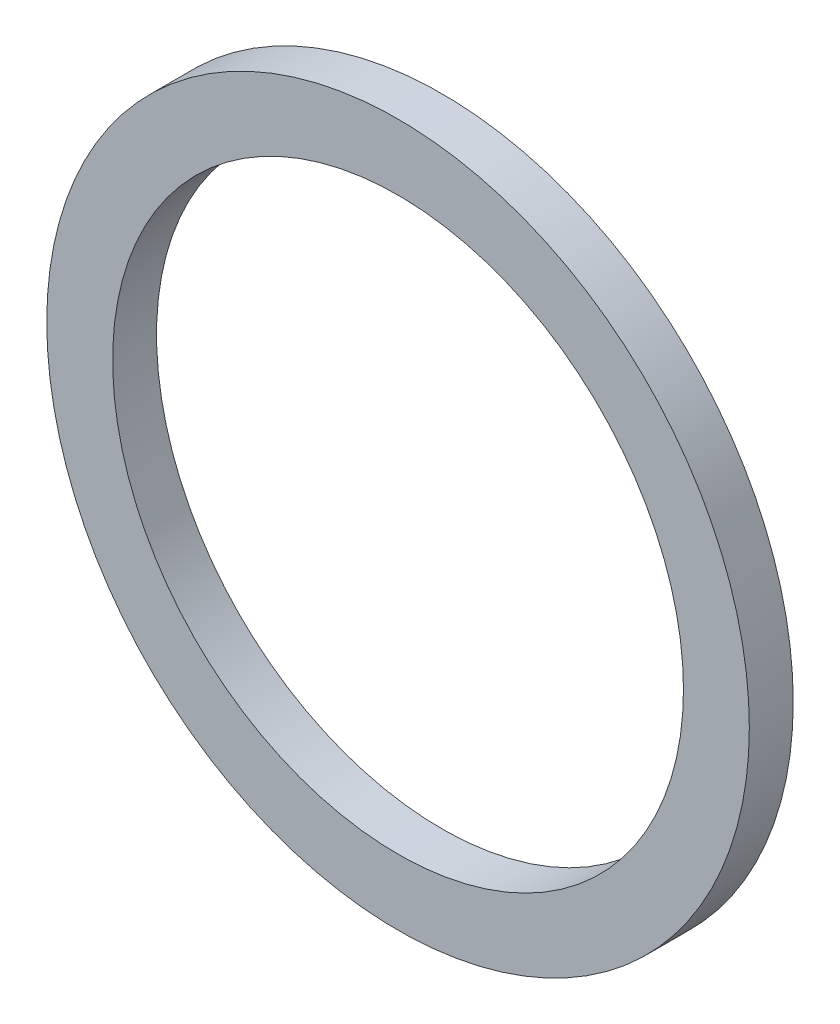
ISO-10303-21;
HEADER;
FILE_DESCRIPTION(('STEP AP214'),'2;1');
FILE_NAME('part.step','',(''),(''),'','','');
FILE_SCHEMA(('AUTOMOTIVE_DESIGN { 1 0 10303 214 1 1 1 1 }'));
ENDSEC;
DATA;
#1=APPLICATION_CONTEXT('core data for automotive mechanical design processes');
#2=APPLICATION_PROTOCOL_DEFINITION('international standard','automotive_design',2000,#1);
#3=PRODUCT_CONTEXT('',#1,'mechanical');
#4=PRODUCT('Part','Part','',(#3));
#5=PRODUCT_RELATED_PRODUCT_CATEGORY('part','',(#4));
#6=PRODUCT_DEFINITION_FORMATION('','',#4);
#7=PRODUCT_DEFINITION_CONTEXT('part definition',#1,'design');
#8=PRODUCT_DEFINITION('design','',#6,#7);
#9=PRODUCT_DEFINITION_SHAPE('','',#8);
#10=(LENGTH_UNIT() NAMED_UNIT(*) SI_UNIT(.MILLI.,.METRE.));
#11=(NAMED_UNIT(*) PLANE_ANGLE_UNIT() SI_UNIT($,.RADIAN.));
#12=(NAMED_UNIT(*) SI_UNIT($,.STERADIAN.) SOLID_ANGLE_UNIT());
#13=UNCERTAINTY_MEASURE_WITH_UNIT(LENGTH_MEASURE(1.E-05),#10,'distance_accuracy_value','');
#14=(GEOMETRIC_REPRESENTATION_CONTEXT(3) GLOBAL_UNCERTAINTY_ASSIGNED_CONTEXT((#13)) GLOBAL_UNIT_ASSIGNED_CONTEXT((#10,
#11,#12)) REPRESENTATION_CONTEXT('',''));
#15=CARTESIAN_POINT('',(0.,0.,0.));
#16=DIRECTION('',(0.,0.,1.));
#17=DIRECTION('',(1.,0.,0.));
#18=AXIS2_PLACEMENT_3D('',#15,#16,#17);
#19=CARTESIAN_POINT('',(0.,0.,12.7));
#20=DIRECTION('',(0.,0.,-1.));
#21=DIRECTION('',(-1.,0.,0.));
#22=AXIS2_PLACEMENT_3D('',#19,#20,#21);
#23=CYLINDRICAL_SURFACE('',#22,82.55);
#24=CARTESIAN_POINT('',(0.,0.,12.7));
#25=DIRECTION('',(0.,0.,1.));
#26=DIRECTION('',(1.,0.,0.));
#27=AXIS2_PLACEMENT_3D('',#24,#25,#26);
#28=CIRCLE('',#27,82.55);
#29=CARTESIAN_POINT('',(82.55,0.,12.7));
#30=VERTEX_POINT('',#29);
#31=EDGE_CURVE('E40',#30,#30,#28,.T.);
#32=ORIENTED_EDGE('',*,*,#31,.T.);
#33=EDGE_LOOP('',(#32));
#34=FACE_BOUND('',#33,.T.);
#35=CARTESIAN_POINT('',(0.,0.,0.));
#36=DIRECTION('',(0.,0.,1.));
#37=DIRECTION('',(1.,0.,0.));
#38=AXIS2_PLACEMENT_3D('',#35,#36,#37);
#39=CIRCLE('',#38,82.55);
#40=CARTESIAN_POINT('',(82.55,0.,0.));
#41=VERTEX_POINT('',#40);
#42=EDGE_CURVE('E46',#41,#41,#39,.T.);
#43=ORIENTED_EDGE('',*,*,#42,.F.);
#44=EDGE_LOOP('',(#43));
#45=FACE_BOUND('',#44,.T.);
#46=ADVANCED_FACE('F33',(#34,#45),#23,.F.);
#47=CARTESIAN_POINT('',(0.,0.,12.7));
#48=DIRECTION('',(0.,0.,-1.));
#49=DIRECTION('',(-1.,0.,0.));
#50=AXIS2_PLACEMENT_3D('',#47,#48,#49);
#51=CYLINDRICAL_SURFACE('',#50,101.6);
#52=CARTESIAN_POINT('',(0.,0.,12.7));
#53=DIRECTION('',(0.,0.,1.));
#54=DIRECTION('',(1.,0.,0.));
#55=AXIS2_PLACEMENT_3D('',#52,#53,#54);
#56=CIRCLE('',#55,101.6);
#57=CARTESIAN_POINT('',(101.6,0.,12.7));
#58=VERTEX_POINT('',#57);
#59=EDGE_CURVE('E10',#58,#58,#56,.T.);
#60=ORIENTED_EDGE('',*,*,#59,.F.);
#61=EDGE_LOOP('',(#60));
#62=FACE_BOUND('',#61,.T.);
#63=CARTESIAN_POINT('',(0.,0.,0.));
#64=DIRECTION('',(0.,0.,1.));
#65=DIRECTION('',(1.,0.,0.));
#66=AXIS2_PLACEMENT_3D('',#63,#64,#65);
#67=CIRCLE('',#66,101.6);
#68=CARTESIAN_POINT('',(101.6,0.,0.));
#69=VERTEX_POINT('',#68);
#70=EDGE_CURVE('E36',#69,#69,#67,.T.);
#71=ORIENTED_EDGE('',*,*,#70,.T.);
#72=EDGE_LOOP('',(#71));
#73=FACE_BOUND('',#72,.T.);
#74=ADVANCED_FACE('F53',(#62,#73),#51,.T.);
#75=CARTESIAN_POINT('',(0.,0.,12.7));
#76=DIRECTION('',(0.,0.,1.));
#77=DIRECTION('',(1.,0.,0.));
#78=AXIS2_PLACEMENT_3D('',#75,#76,#77);
#79=PLANE('',#78);
#80=ORIENTED_EDGE('',*,*,#31,.F.);
#81=EDGE_LOOP('',(#80));
#82=FACE_BOUND('',#81,.T.);
#83=ORIENTED_EDGE('',*,*,#59,.T.);
#84=EDGE_LOOP('',(#83));
#85=FACE_BOUND('',#84,.T.);
#86=ADVANCED_FACE('F57',(#82,#85),#79,.T.);
#87=CARTESIAN_POINT('',(0.,0.,0.));
#88=DIRECTION('',(0.,0.,1.));
#89=DIRECTION('',(1.,0.,0.));
#90=AXIS2_PLACEMENT_3D('',#87,#88,#89);
#91=PLANE('',#90);
#92=ORIENTED_EDGE('',*,*,#42,.T.);
#93=EDGE_LOOP('',(#92));
#94=FACE_BOUND('',#93,.T.);
#95=ORIENTED_EDGE('',*,*,#70,.F.);
#96=EDGE_LOOP('',(#95));
#97=FACE_BOUND('',#96,.T.);
#98=ADVANCED_FACE('F55',(#94,#97),#91,.F.);
#99=CLOSED_SHELL('',(#46,#74,#86,#98));
#100=MANIFOLD_SOLID_BREP('B2',#99);
#101=ADVANCED_BREP_SHAPE_REPRESENTATION('',(#18,#100),#14);
#102=SHAPE_DEFINITION_REPRESENTATION(#9,#101);
ENDSEC;
END-ISO-10303-21;
